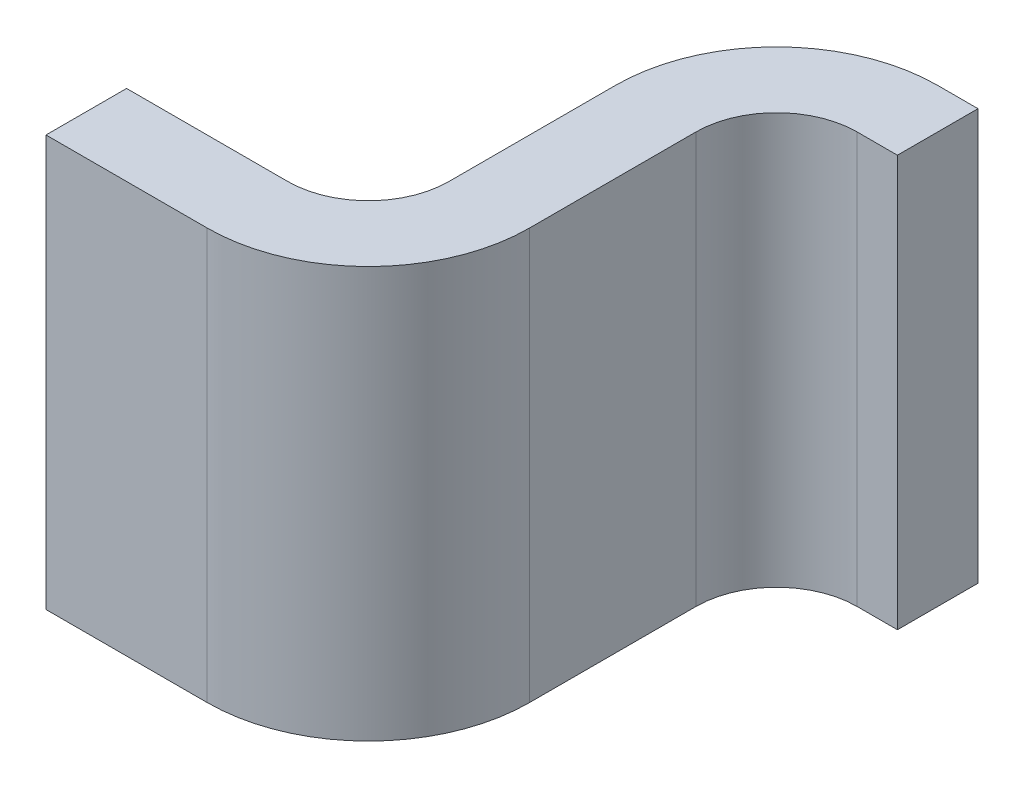
ISO-10303-21;
HEADER;
FILE_DESCRIPTION(('STEP AP214'),'2;1');
FILE_NAME('part.step','',(''),(''),'','','');
FILE_SCHEMA(('AUTOMOTIVE_DESIGN { 1 0 10303 214 1 1 1 1 }'));
ENDSEC;
DATA;
#1=APPLICATION_CONTEXT('core data for automotive mechanical design processes');
#2=APPLICATION_PROTOCOL_DEFINITION('international standard','automotive_design',2000,#1);
#3=PRODUCT_CONTEXT('',#1,'mechanical');
#4=PRODUCT('Part','Part','',(#3));
#5=PRODUCT_RELATED_PRODUCT_CATEGORY('part','',(#4));
#6=PRODUCT_DEFINITION_FORMATION('','',#4);
#7=PRODUCT_DEFINITION_CONTEXT('part definition',#1,'design');
#8=PRODUCT_DEFINITION('design','',#6,#7);
#9=PRODUCT_DEFINITION_SHAPE('','',#8);
#10=(LENGTH_UNIT() NAMED_UNIT(*) SI_UNIT(.MILLI.,.METRE.));
#11=(NAMED_UNIT(*) PLANE_ANGLE_UNIT() SI_UNIT($,.RADIAN.));
#12=(NAMED_UNIT(*) SI_UNIT($,.STERADIAN.) SOLID_ANGLE_UNIT());
#13=UNCERTAINTY_MEASURE_WITH_UNIT(LENGTH_MEASURE(1.E-05),#10,'distance_accuracy_value','');
#14=(GEOMETRIC_REPRESENTATION_CONTEXT(3) GLOBAL_UNCERTAINTY_ASSIGNED_CONTEXT((#13)) GLOBAL_UNIT_ASSIGNED_CONTEXT((#10,
#11,#12)) REPRESENTATION_CONTEXT('',''));
#15=CARTESIAN_POINT('',(0.,0.,0.));
#16=DIRECTION('',(0.,0.,1.));
#17=DIRECTION('',(1.,0.,0.));
#18=AXIS2_PLACEMENT_3D('',#15,#16,#17);
#19=CARTESIAN_POINT('',(0.,0.255,0.6065));
#20=DIRECTION('',(0.,0.,-1.));
#21=DIRECTION('',(-1.,0.,0.));
#22=AXIS2_PLACEMENT_3D('',#19,#20,#21);
#23=PLANE('',#22);
#24=DIRECTION('',(1.,0.,0.));
#25=VECTOR('',#24,1.);
#26=CARTESIAN_POINT('',(0.,0.255,0.6065));
#27=LINE('',#26,#25);
#28=CARTESIAN_POINT('',(0.2,0.255,0.6065));
#29=VERTEX_POINT('',#28);
#30=CARTESIAN_POINT('',(0.,0.255,0.6065));
#31=VERTEX_POINT('',#30);
#32=EDGE_CURVE('E192',#29,#31,#27,.F.);
#33=ORIENTED_EDGE('',*,*,#32,.T.);
#34=DIRECTION('',(0.,1.,0.));
#35=VECTOR('',#34,1.);
#36=CARTESIAN_POINT('',(0.,-0.255,0.6065));
#37=LINE('',#36,#35);
#38=CARTESIAN_POINT('',(0.,-0.255,0.6065));
#39=VERTEX_POINT('',#38);
#40=EDGE_CURVE('E94',#39,#31,#37,.T.);
#41=ORIENTED_EDGE('',*,*,#40,.F.);
#42=DIRECTION('',(1.,0.,0.));
#43=VECTOR('',#42,1.);
#44=CARTESIAN_POINT('',(0.,-0.255,0.6065));
#45=LINE('',#44,#43);
#46=CARTESIAN_POINT('',(0.2,-0.255,0.6065));
#47=VERTEX_POINT('',#46);
#48=EDGE_CURVE('E175',#39,#47,#45,.T.);
#49=ORIENTED_EDGE('',*,*,#48,.T.);
#50=DIRECTION('',(0.,1.,0.));
#51=VECTOR('',#50,1.);
#52=CARTESIAN_POINT('',(0.2,0.255,0.6065));
#53=LINE('',#52,#51);
#54=EDGE_CURVE('E86',#29,#47,#53,.F.);
#55=ORIENTED_EDGE('',*,*,#54,.F.);
#56=EDGE_LOOP('',(#33,#41,#49,#55));
#57=FACE_BOUND('',#56,.T.);
#58=ADVANCED_FACE('F17',(#57),#23,.F.);
#59=CARTESIAN_POINT('',(0.,-0.255,0.5065));
#60=DIRECTION('',(-1.,0.,0.));
#61=DIRECTION('',(0.,0.,1.));
#62=AXIS2_PLACEMENT_3D('',#59,#60,#61);
#63=PLANE('',#62);
#64=DIRECTION('',(0.,0.,1.));
#65=VECTOR('',#64,1.);
#66=CARTESIAN_POINT('',(0.,0.255,0.5065));
#67=LINE('',#66,#65);
#68=CARTESIAN_POINT('',(0.,0.255,0.5065));
#69=VERTEX_POINT('',#68);
#70=EDGE_CURVE('E182',#31,#69,#67,.F.);
#71=ORIENTED_EDGE('',*,*,#70,.T.);
#72=DIRECTION('',(0.,1.,0.));
#73=VECTOR('',#72,1.);
#74=CARTESIAN_POINT('',(0.,-0.255,0.5065));
#75=LINE('',#74,#73);
#76=CARTESIAN_POINT('',(0.,-0.255,0.5065));
#77=VERTEX_POINT('',#76);
#78=EDGE_CURVE('E165',#69,#77,#75,.F.);
#79=ORIENTED_EDGE('',*,*,#78,.T.);
#80=DIRECTION('',(0.,0.,1.));
#81=VECTOR('',#80,1.);
#82=CARTESIAN_POINT('',(0.,-0.255,0.6065));
#83=LINE('',#82,#81);
#84=EDGE_CURVE('E177',#77,#39,#83,.T.);
#85=ORIENTED_EDGE('',*,*,#84,.T.);
#86=ORIENTED_EDGE('',*,*,#40,.T.);
#87=EDGE_LOOP('',(#71,#79,#85,#86));
#88=FACE_BOUND('',#87,.T.);
#89=ADVANCED_FACE('F227',(#88),#63,.T.);
#90=CARTESIAN_POINT('',(0.2,0.255,0.4065));
#91=DIRECTION('',(0.,1.,0.));
#92=DIRECTION('',(0.,0.,1.));
#93=AXIS2_PLACEMENT_3D('',#90,#91,#92);
#94=CYLINDRICAL_SURFACE('',#93,0.2);
#95=CARTESIAN_POINT('',(0.2,0.255,0.4065));
#96=DIRECTION('',(0.,1.,0.));
#97=DIRECTION('',(0.,0.,1.));
#98=AXIS2_PLACEMENT_3D('',#95,#96,#97);
#99=CIRCLE('',#98,0.2);
#100=CARTESIAN_POINT('',(0.4,0.255,0.4065));
#101=VERTEX_POINT('',#100);
#102=EDGE_CURVE('E20',#29,#101,#99,.T.);
#103=ORIENTED_EDGE('',*,*,#102,.F.);
#104=ORIENTED_EDGE('',*,*,#54,.T.);
#105=CARTESIAN_POINT('',(0.2,-0.255,0.4065));
#106=DIRECTION('',(0.,1.,0.));
#107=DIRECTION('',(0.,0.,1.));
#108=AXIS2_PLACEMENT_3D('',#105,#106,#107);
#109=CIRCLE('',#108,0.2);
#110=CARTESIAN_POINT('',(0.4,-0.255,0.4065));
#111=VERTEX_POINT('',#110);
#112=EDGE_CURVE('E158',#111,#47,#109,.F.);
#113=ORIENTED_EDGE('',*,*,#112,.F.);
#114=DIRECTION('',(0.,1.,0.));
#115=VECTOR('',#114,1.);
#116=CARTESIAN_POINT('',(0.4,0.255,0.4065));
#117=LINE('',#116,#115);
#118=EDGE_CURVE('E153',#111,#101,#117,.T.);
#119=ORIENTED_EDGE('',*,*,#118,.T.);
#120=EDGE_LOOP('',(#103,#104,#113,#119));
#121=FACE_BOUND('',#120,.T.);
#122=ADVANCED_FACE('F215',(#121),#94,.T.);
#123=CARTESIAN_POINT('',(0.5,0.255,0.1));
#124=DIRECTION('',(0.,0.,-1.));
#125=DIRECTION('',(-1.,0.,0.));
#126=AXIS2_PLACEMENT_3D('',#123,#124,#125);
#127=PLANE('',#126);
#128=DIRECTION('',(1.,0.,0.));
#129=VECTOR('',#128,1.);
#130=CARTESIAN_POINT('',(0.5,0.255,0.1));
#131=LINE('',#130,#129);
#132=CARTESIAN_POINT('',(0.55,0.255,0.1));
#133=VERTEX_POINT('',#132);
#134=CARTESIAN_POINT('',(0.5,0.255,0.1));
#135=VERTEX_POINT('',#134);
#136=EDGE_CURVE('E151',#133,#135,#131,.F.);
#137=ORIENTED_EDGE('',*,*,#136,.T.);
#138=DIRECTION('',(0.,-1.,0.));
#139=VECTOR('',#138,1.);
#140=CARTESIAN_POINT('',(0.5,0.255,0.1));
#141=LINE('',#140,#139);
#142=CARTESIAN_POINT('',(0.5,-0.255,0.1));
#143=VERTEX_POINT('',#142);
#144=EDGE_CURVE('E150',#135,#143,#141,.T.);
#145=ORIENTED_EDGE('',*,*,#144,.T.);
#146=DIRECTION('',(1.,0.,0.));
#147=VECTOR('',#146,1.);
#148=CARTESIAN_POINT('',(0.5,-0.255,0.1));
#149=LINE('',#148,#147);
#150=CARTESIAN_POINT('',(0.55,-0.255,0.1));
#151=VERTEX_POINT('',#150);
#152=EDGE_CURVE('E121',#143,#151,#149,.T.);
#153=ORIENTED_EDGE('',*,*,#152,.T.);
#154=DIRECTION('',(0.,1.,0.));
#155=VECTOR('',#154,1.);
#156=CARTESIAN_POINT('',(0.55,-0.255,0.1));
#157=LINE('',#156,#155);
#158=EDGE_CURVE('E118',#151,#133,#157,.T.);
#159=ORIENTED_EDGE('',*,*,#158,.T.);
#160=EDGE_LOOP('',(#137,#145,#153,#159));
#161=FACE_BOUND('',#160,.T.);
#162=ADVANCED_FACE('F265',(#161),#127,.F.);
#163=CARTESIAN_POINT('',(0.,-0.255,0.5065));
#164=DIRECTION('',(0.,0.,1.));
#165=DIRECTION('',(1.,0.,0.));
#166=AXIS2_PLACEMENT_3D('',#163,#164,#165);
#167=PLANE('',#166);
#168=DIRECTION('',(1.,0.,0.));
#169=VECTOR('',#168,1.);
#170=CARTESIAN_POINT('',(0.,-0.255,0.5065));
#171=LINE('',#170,#169);
#172=CARTESIAN_POINT('',(0.2,-0.255,0.5065));
#173=VERTEX_POINT('',#172);
#174=EDGE_CURVE('E163',#77,#173,#171,.T.);
#175=ORIENTED_EDGE('',*,*,#174,.F.);
#176=ORIENTED_EDGE('',*,*,#78,.F.);
#177=DIRECTION('',(1.,0.,0.));
#178=VECTOR('',#177,1.);
#179=CARTESIAN_POINT('',(0.,0.255,0.5065));
#180=LINE('',#179,#178);
#181=CARTESIAN_POINT('',(0.2,0.255,0.5065));
#182=VERTEX_POINT('',#181);
#183=EDGE_CURVE('E168',#182,#69,#180,.F.);
#184=ORIENTED_EDGE('',*,*,#183,.F.);
#185=DIRECTION('',(0.,1.,0.));
#186=VECTOR('',#185,1.);
#187=CARTESIAN_POINT('',(0.2,-0.255,0.5065));
#188=LINE('',#187,#186);
#189=EDGE_CURVE('E159',#182,#173,#188,.F.);
#190=ORIENTED_EDGE('',*,*,#189,.T.);
#191=EDGE_LOOP('',(#175,#176,#184,#190));
#192=FACE_BOUND('',#191,.T.);
#193=ADVANCED_FACE('F262',(#192),#167,.F.);
#194=CARTESIAN_POINT('',(0.4,0.255,0.4065));
#195=DIRECTION('',(-1.,0.,0.));
#196=DIRECTION('',(0.,0.,1.));
#197=AXIS2_PLACEMENT_3D('',#194,#195,#196);
#198=PLANE('',#197);
#199=DIRECTION('',(0.,0.,-1.));
#200=VECTOR('',#199,1.);
#201=CARTESIAN_POINT('',(0.4,0.255,0.4065));
#202=LINE('',#201,#200);
#203=CARTESIAN_POINT('',(0.4,0.255,0.2));
#204=VERTEX_POINT('',#203);
#205=EDGE_CURVE('E146',#204,#101,#202,.F.);
#206=ORIENTED_EDGE('',*,*,#205,.T.);
#207=ORIENTED_EDGE('',*,*,#118,.F.);
#208=DIRECTION('',(0.,0.,1.));
#209=VECTOR('',#208,1.);
#210=CARTESIAN_POINT('',(0.4,-0.255,0.4065));
#211=LINE('',#210,#209);
#212=CARTESIAN_POINT('',(0.4,-0.255,0.2));
#213=VERTEX_POINT('',#212);
#214=EDGE_CURVE('E207',#111,#213,#211,.F.);
#215=ORIENTED_EDGE('',*,*,#214,.T.);
#216=DIRECTION('',(0.,-1.,0.));
#217=VECTOR('',#216,1.);
#218=CARTESIAN_POINT('',(0.4,0.255,0.2));
#219=LINE('',#218,#217);
#220=EDGE_CURVE('E120',#213,#204,#219,.F.);
#221=ORIENTED_EDGE('',*,*,#220,.T.);
#222=EDGE_LOOP('',(#206,#207,#215,#221));
#223=FACE_BOUND('',#222,.T.);
#224=ADVANCED_FACE('F217',(#223),#198,.F.);
#225=CARTESIAN_POINT('',(0.55,-0.255,0.));
#226=DIRECTION('',(-1.,0.,0.));
#227=DIRECTION('',(0.,0.,1.));
#228=AXIS2_PLACEMENT_3D('',#225,#226,#227);
#229=PLANE('',#228);
#230=DIRECTION('',(0.,0.,1.));
#231=VECTOR('',#230,1.);
#232=CARTESIAN_POINT('',(0.55,0.255,0.));
#233=LINE('',#232,#231);
#234=CARTESIAN_POINT('',(0.55,0.255,0.));
#235=VERTEX_POINT('',#234);
#236=EDGE_CURVE('E142',#133,#235,#233,.F.);
#237=ORIENTED_EDGE('',*,*,#236,.F.);
#238=ORIENTED_EDGE('',*,*,#158,.F.);
#239=DIRECTION('',(0.,0.,1.));
#240=VECTOR('',#239,1.);
#241=CARTESIAN_POINT('',(0.55,-0.255,0.1));
#242=LINE('',#241,#240);
#243=CARTESIAN_POINT('',(0.55,-0.255,0.));
#244=VERTEX_POINT('',#243);
#245=EDGE_CURVE('E111',#151,#244,#242,.F.);
#246=ORIENTED_EDGE('',*,*,#245,.T.);
#247=DIRECTION('',(0.,1.,0.));
#248=VECTOR('',#247,1.);
#249=CARTESIAN_POINT('',(0.55,-0.255,0.));
#250=LINE('',#249,#248);
#251=EDGE_CURVE('E116',#244,#235,#250,.T.);
#252=ORIENTED_EDGE('',*,*,#251,.T.);
#253=EDGE_LOOP('',(#237,#238,#246,#252));
#254=FACE_BOUND('',#253,.T.);
#255=ADVANCED_FACE('F114',(#254),#229,.F.);
#256=CARTESIAN_POINT('',(0.5,0.255,0.2));
#257=DIRECTION('',(0.,-1.,0.));
#258=DIRECTION('',(0.,0.,-1.));
#259=AXIS2_PLACEMENT_3D('',#256,#257,#258);
#260=CYLINDRICAL_SURFACE('',#259,0.1);
#261=CARTESIAN_POINT('',(0.5,0.255,0.2));
#262=DIRECTION('',(0.,-1.,0.));
#263=DIRECTION('',(0.,0.,-1.));
#264=AXIS2_PLACEMENT_3D('',#261,#262,#263);
#265=CIRCLE('',#264,0.1);
#266=EDGE_CURVE('E204',#204,#135,#265,.T.);
#267=ORIENTED_EDGE('',*,*,#266,.F.);
#268=ORIENTED_EDGE('',*,*,#220,.F.);
#269=CARTESIAN_POINT('',(0.5,-0.255,0.2));
#270=DIRECTION('',(0.,-1.,0.));
#271=DIRECTION('',(0.,0.,-1.));
#272=AXIS2_PLACEMENT_3D('',#269,#270,#271);
#273=CIRCLE('',#272,0.1);
#274=EDGE_CURVE('E133',#143,#213,#273,.F.);
#275=ORIENTED_EDGE('',*,*,#274,.F.);
#276=ORIENTED_EDGE('',*,*,#144,.F.);
#277=EDGE_LOOP('',(#267,#268,#275,#276));
#278=FACE_BOUND('',#277,.T.);
#279=ADVANCED_FACE('F253',(#278),#260,.F.);
#280=CARTESIAN_POINT('',(0.2,-0.255,0.4065));
#281=DIRECTION('',(0.,1.,0.));
#282=DIRECTION('',(0.,0.,1.));
#283=AXIS2_PLACEMENT_3D('',#280,#281,#282);
#284=CYLINDRICAL_SURFACE('',#283,0.1);
#285=CARTESIAN_POINT('',(0.2,-0.255,0.4065));
#286=DIRECTION('',(0.,1.,0.));
#287=DIRECTION('',(0.,0.,1.));
#288=AXIS2_PLACEMENT_3D('',#285,#286,#287);
#289=CIRCLE('',#288,0.1);
#290=CARTESIAN_POINT('',(0.3,-0.255,0.4065));
#291=VERTEX_POINT('',#290);
#292=EDGE_CURVE('E162',#173,#291,#289,.T.);
#293=ORIENTED_EDGE('',*,*,#292,.F.);
#294=ORIENTED_EDGE('',*,*,#189,.F.);
#295=CARTESIAN_POINT('',(0.2,0.255,0.4065));
#296=DIRECTION('',(0.,1.,0.));
#297=DIRECTION('',(0.,0.,1.));
#298=AXIS2_PLACEMENT_3D('',#295,#296,#297);
#299=CIRCLE('',#298,0.1);
#300=CARTESIAN_POINT('',(0.3,0.255,0.4065));
#301=VERTEX_POINT('',#300);
#302=EDGE_CURVE('E149',#301,#182,#299,.F.);
#303=ORIENTED_EDGE('',*,*,#302,.F.);
#304=DIRECTION('',(0.,1.,0.));
#305=VECTOR('',#304,1.);
#306=CARTESIAN_POINT('',(0.3,-0.255,0.4065));
#307=LINE('',#306,#305);
#308=EDGE_CURVE('E368',#301,#291,#307,.F.);
#309=ORIENTED_EDGE('',*,*,#308,.T.);
#310=EDGE_LOOP('',(#293,#294,#303,#309));
#311=FACE_BOUND('',#310,.T.);
#312=ADVANCED_FACE('F250',(#311),#284,.F.);
#313=CARTESIAN_POINT('',(0.393933982822,0.255,0.09393398282202));
#314=DIRECTION('',(0.,1.,0.));
#315=DIRECTION('',(0.,0.,1.));
#316=AXIS2_PLACEMENT_3D('',#313,#314,#315);
#317=PLANE('',#316);
#318=CARTESIAN_POINT('',(0.5,0.255,0.2));
#319=DIRECTION('',(0.,-1.,0.));
#320=DIRECTION('',(0.,0.,-1.));
#321=AXIS2_PLACEMENT_3D('',#318,#319,#320);
#322=CIRCLE('',#321,0.2);
#323=CARTESIAN_POINT('',(0.3,0.255,0.2));
#324=VERTEX_POINT('',#323);
#325=CARTESIAN_POINT('',(0.5,0.255,0.));
#326=VERTEX_POINT('',#325);
#327=EDGE_CURVE('E201',#324,#326,#322,.T.);
#328=ORIENTED_EDGE('',*,*,#327,.F.);
#329=DIRECTION('',(0.,0.,-1.));
#330=VECTOR('',#329,1.);
#331=CARTESIAN_POINT('',(0.3,0.255,0.4065));
#332=LINE('',#331,#330);
#333=EDGE_CURVE('E135',#324,#301,#332,.F.);
#334=ORIENTED_EDGE('',*,*,#333,.T.);
#335=ORIENTED_EDGE('',*,*,#302,.T.);
#336=ORIENTED_EDGE('',*,*,#183,.T.);
#337=ORIENTED_EDGE('',*,*,#70,.F.);
#338=ORIENTED_EDGE('',*,*,#32,.F.);
#339=ORIENTED_EDGE('',*,*,#102,.T.);
#340=ORIENTED_EDGE('',*,*,#205,.F.);
#341=ORIENTED_EDGE('',*,*,#266,.T.);
#342=ORIENTED_EDGE('',*,*,#136,.F.);
#343=ORIENTED_EDGE('',*,*,#236,.T.);
#344=DIRECTION('',(1.,0.,0.));
#345=VECTOR('',#344,1.);
#346=CARTESIAN_POINT('',(0.5,0.255,0.));
#347=LINE('',#346,#345);
#348=EDGE_CURVE('E130',#235,#326,#347,.F.);
#349=ORIENTED_EDGE('',*,*,#348,.T.);
#350=EDGE_LOOP('',(#328,#334,#335,#336,#337,#338,#339,#340,#341,#342,#343,#349));
#351=FACE_BOUND('',#350,.T.);
#352=ADVANCED_FACE('F224',(#351),#317,.T.);
#353=CARTESIAN_POINT('',(0.5,-0.255,0.));
#354=DIRECTION('',(0.,0.,1.));
#355=DIRECTION('',(1.,0.,0.));
#356=AXIS2_PLACEMENT_3D('',#353,#354,#355);
#357=PLANE('',#356);
#358=DIRECTION('',(1.,0.,0.));
#359=VECTOR('',#358,1.);
#360=CARTESIAN_POINT('',(0.5,-0.255,0.));
#361=LINE('',#360,#359);
#362=CARTESIAN_POINT('',(0.5,-0.255,0.));
#363=VERTEX_POINT('',#362);
#364=EDGE_CURVE('E123',#363,#244,#361,.T.);
#365=ORIENTED_EDGE('',*,*,#364,.F.);
#366=DIRECTION('',(0.,-1.,0.));
#367=VECTOR('',#366,1.);
#368=CARTESIAN_POINT('',(0.5,-0.255,0.));
#369=LINE('',#368,#367);
#370=EDGE_CURVE('E200',#326,#363,#369,.T.);
#371=ORIENTED_EDGE('',*,*,#370,.F.);
#372=ORIENTED_EDGE('',*,*,#348,.F.);
#373=ORIENTED_EDGE('',*,*,#251,.F.);
#374=EDGE_LOOP('',(#365,#371,#372,#373));
#375=FACE_BOUND('',#374,.T.);
#376=ADVANCED_FACE('F132',(#375),#357,.F.);
#377=CARTESIAN_POINT('',(0.393933982822,-0.255,0.09393398282202));
#378=DIRECTION('',(0.,-1.,0.));
#379=DIRECTION('',(0.,0.,-1.));
#380=AXIS2_PLACEMENT_3D('',#377,#378,#379);
#381=PLANE('',#380);
#382=ORIENTED_EDGE('',*,*,#274,.T.);
#383=ORIENTED_EDGE('',*,*,#214,.F.);
#384=ORIENTED_EDGE('',*,*,#112,.T.);
#385=ORIENTED_EDGE('',*,*,#48,.F.);
#386=ORIENTED_EDGE('',*,*,#84,.F.);
#387=ORIENTED_EDGE('',*,*,#174,.T.);
#388=ORIENTED_EDGE('',*,*,#292,.T.);
#389=DIRECTION('',(0.,0.,-1.));
#390=VECTOR('',#389,1.);
#391=CARTESIAN_POINT('',(0.3,-0.255,0.4065));
#392=LINE('',#391,#390);
#393=CARTESIAN_POINT('',(0.3,-0.255,0.2));
#394=VERTEX_POINT('',#393);
#395=EDGE_CURVE('E35',#291,#394,#392,.T.);
#396=ORIENTED_EDGE('',*,*,#395,.T.);
#397=CARTESIAN_POINT('',(0.5,-0.255,0.2));
#398=DIRECTION('',(0.,-1.,0.));
#399=DIRECTION('',(0.,0.,-1.));
#400=AXIS2_PLACEMENT_3D('',#397,#398,#399);
#401=CIRCLE('',#400,0.2);
#402=EDGE_CURVE('E26',#363,#394,#401,.F.);
#403=ORIENTED_EDGE('',*,*,#402,.F.);
#404=ORIENTED_EDGE('',*,*,#364,.T.);
#405=ORIENTED_EDGE('',*,*,#245,.F.);
#406=ORIENTED_EDGE('',*,*,#152,.F.);
#407=EDGE_LOOP('',(#382,#383,#384,#385,#386,#387,#388,#396,#403,#404,#405,#406));
#408=FACE_BOUND('',#407,.T.);
#409=ADVANCED_FACE('F125',(#408),#381,.T.);
#410=CARTESIAN_POINT('',(0.3,-0.255,0.4065));
#411=DIRECTION('',(1.,0.,0.));
#412=DIRECTION('',(0.,0.,-1.));
#413=AXIS2_PLACEMENT_3D('',#410,#411,#412);
#414=PLANE('',#413);
#415=ORIENTED_EDGE('',*,*,#395,.F.);
#416=ORIENTED_EDGE('',*,*,#308,.F.);
#417=ORIENTED_EDGE('',*,*,#333,.F.);
#418=DIRECTION('',(0.,-1.,0.));
#419=VECTOR('',#418,1.);
#420=CARTESIAN_POINT('',(0.3,-0.255,0.2));
#421=LINE('',#420,#419);
#422=EDGE_CURVE('E11',#394,#324,#421,.F.);
#423=ORIENTED_EDGE('',*,*,#422,.F.);
#424=EDGE_LOOP('',(#415,#416,#417,#423));
#425=FACE_BOUND('',#424,.T.);
#426=ADVANCED_FACE('F235',(#425),#414,.F.);
#427=CARTESIAN_POINT('',(0.5,-0.255,0.2));
#428=DIRECTION('',(0.,-1.,0.));
#429=DIRECTION('',(0.,0.,-1.));
#430=AXIS2_PLACEMENT_3D('',#427,#428,#429);
#431=CYLINDRICAL_SURFACE('',#430,0.2);
#432=ORIENTED_EDGE('',*,*,#402,.T.);
#433=ORIENTED_EDGE('',*,*,#422,.T.);
#434=ORIENTED_EDGE('',*,*,#327,.T.);
#435=ORIENTED_EDGE('',*,*,#370,.T.);
#436=EDGE_LOOP('',(#432,#433,#434,#435));
#437=FACE_BOUND('',#436,.T.);
#438=ADVANCED_FACE('F233',(#437),#431,.T.);
#439=CLOSED_SHELL('',(#58,#89,#122,#162,#193,#224,#255,#279,#312,#352,#376,#409,#426,#438));
#440=MANIFOLD_SOLID_BREP('B1',#439);
#441=ADVANCED_BREP_SHAPE_REPRESENTATION('',(#18,#440),#14);
#442=SHAPE_DEFINITION_REPRESENTATION(#9,#441);
ENDSEC;
END-ISO-10303-21;
